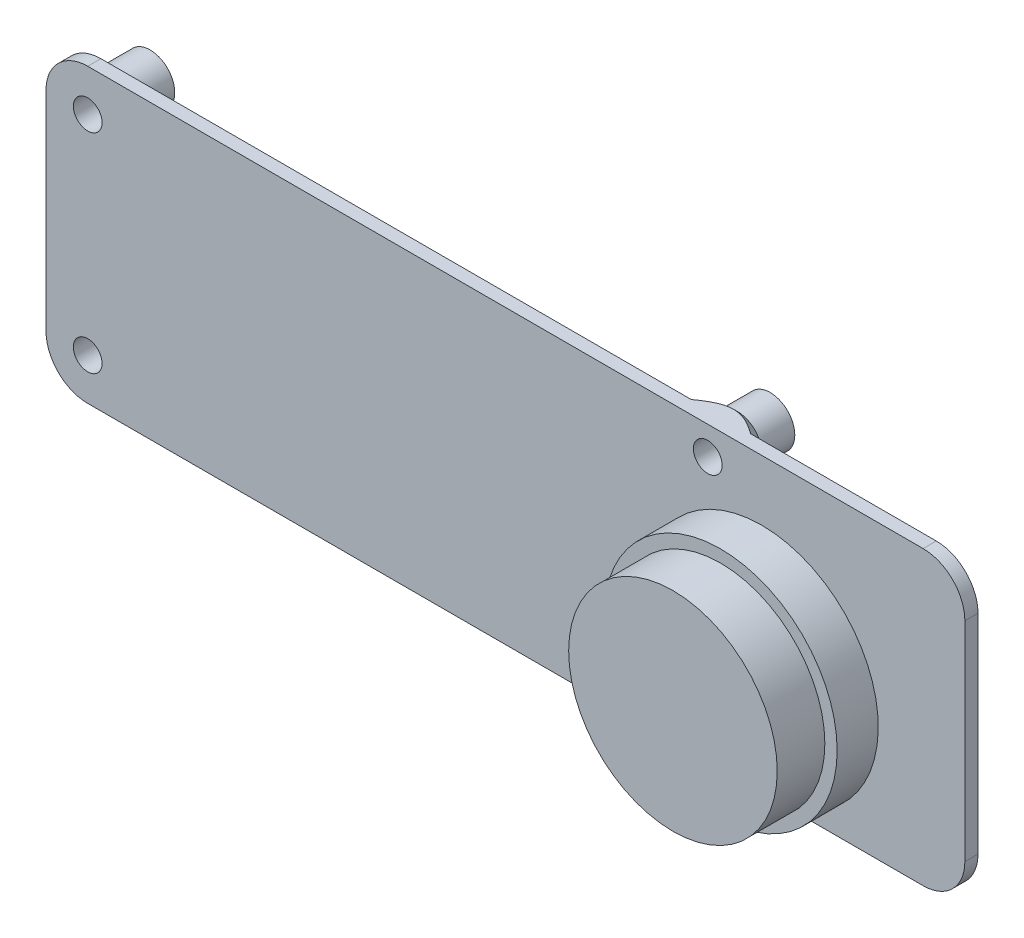
ISO-10303-21;
HEADER;
FILE_DESCRIPTION(('STEP AP214'),'2;1');
FILE_NAME('part.step','',(''),(''),'','','');
FILE_SCHEMA(('AUTOMOTIVE_DESIGN { 1 0 10303 214 1 1 1 1 }'));
ENDSEC;
DATA;
#1=APPLICATION_CONTEXT('core data for automotive mechanical design processes');
#2=APPLICATION_PROTOCOL_DEFINITION('international standard','automotive_design',2000,#1);
#3=PRODUCT_CONTEXT('',#1,'mechanical');
#4=PRODUCT('Part','Part','',(#3));
#5=PRODUCT_RELATED_PRODUCT_CATEGORY('part','',(#4));
#6=PRODUCT_DEFINITION_FORMATION('','',#4);
#7=PRODUCT_DEFINITION_CONTEXT('part definition',#1,'design');
#8=PRODUCT_DEFINITION('design','',#6,#7);
#9=PRODUCT_DEFINITION_SHAPE('','',#8);
#10=(LENGTH_UNIT() NAMED_UNIT(*) SI_UNIT(.MILLI.,.METRE.));
#11=(NAMED_UNIT(*) PLANE_ANGLE_UNIT() SI_UNIT($,.RADIAN.));
#12=(NAMED_UNIT(*) SI_UNIT($,.STERADIAN.) SOLID_ANGLE_UNIT());
#13=UNCERTAINTY_MEASURE_WITH_UNIT(LENGTH_MEASURE(1.E-05),#10,'distance_accuracy_value','');
#14=(GEOMETRIC_REPRESENTATION_CONTEXT(3) GLOBAL_UNCERTAINTY_ASSIGNED_CONTEXT((#13)) GLOBAL_UNIT_ASSIGNED_CONTEXT((#10,
#11,#12)) REPRESENTATION_CONTEXT('',''));
#15=CARTESIAN_POINT('',(0.,0.,0.));
#16=DIRECTION('',(0.,0.,1.));
#17=DIRECTION('',(1.,0.,0.));
#18=AXIS2_PLACEMENT_3D('',#15,#16,#17);
#19=CARTESIAN_POINT('',(0.,-25.4,1.6));
#20=DIRECTION('',(0.,0.,1.));
#21=DIRECTION('',(1.,0.,0.));
#22=AXIS2_PLACEMENT_3D('',#19,#20,#21);
#23=PLANE('',#22);
#24=CARTESIAN_POINT('',(64.33,-27.48,1.6));
#25=DIRECTION('',(0.,0.,1.));
#26=DIRECTION('',(1.,0.,0.));
#27=AXIS2_PLACEMENT_3D('',#24,#25,#26);
#28=CIRCLE('',#27,1.75);
#29=CARTESIAN_POINT('',(66.08,-27.48,1.6));
#30=VERTEX_POINT('',#29);
#31=EDGE_CURVE('E188',#30,#30,#28,.T.);
#32=ORIENTED_EDGE('',*,*,#31,.F.);
#33=EDGE_LOOP('',(#32));
#34=FACE_BOUND('',#33,.T.);
#35=CARTESIAN_POINT('',(0.,-25.4,1.6));
#36=DIRECTION('',(0.,0.,1.));
#37=DIRECTION('',(1.,0.,0.));
#38=AXIS2_PLACEMENT_3D('',#35,#36,#37);
#39=CIRCLE('',#38,1.75);
#40=CARTESIAN_POINT('',(1.75,-25.4,1.6));
#41=VERTEX_POINT('',#40);
#42=EDGE_CURVE('E194',#41,#41,#39,.T.);
#43=ORIENTED_EDGE('',*,*,#42,.F.);
#44=EDGE_LOOP('',(#43));
#45=FACE_BOUND('',#44,.T.);
#46=CARTESIAN_POINT('',(0.,0.,1.6));
#47=DIRECTION('',(0.,0.,1.));
#48=DIRECTION('',(1.,0.,0.));
#49=AXIS2_PLACEMENT_3D('',#46,#47,#48);
#50=CIRCLE('',#49,1.75);
#51=CARTESIAN_POINT('',(1.75,0.,1.6));
#52=VERTEX_POINT('',#51);
#53=EDGE_CURVE('E197',#52,#52,#50,.T.);
#54=ORIENTED_EDGE('',*,*,#53,.F.);
#55=EDGE_LOOP('',(#54));
#56=FACE_BOUND('',#55,.T.);
#57=CARTESIAN_POINT('',(75.51,1.63,1.6));
#58=DIRECTION('',(0.,0.,1.));
#59=DIRECTION('',(1.,0.,0.));
#60=AXIS2_PLACEMENT_3D('',#57,#58,#59);
#61=CIRCLE('',#60,1.75);
#62=CARTESIAN_POINT('',(77.26,1.63,1.6));
#63=VERTEX_POINT('',#62);
#64=EDGE_CURVE('E191',#63,#63,#61,.T.);
#65=ORIENTED_EDGE('',*,*,#64,.F.);
#66=EDGE_LOOP('',(#65));
#67=FACE_BOUND('',#66,.T.);
#68=DIRECTION('',(1.,0.,0.));
#69=VECTOR('',#68,1.);
#70=CARTESIAN_POINT('',(0.,-30.48,1.6));
#71=LINE('',#70,#69);
#72=CARTESIAN_POINT('',(0.,-30.48,1.6));
#73=VERTEX_POINT('',#72);
#74=CARTESIAN_POINT('',(79.6951315825924,-30.48,1.6));
#75=VERTEX_POINT('',#74);
#76=EDGE_CURVE('E140',#73,#75,#71,.T.);
#77=ORIENTED_EDGE('',*,*,#76,.T.);
#78=CARTESIAN_POINT('',(82.07,-16.48,1.6));
#79=DIRECTION('',(0.,0.,1.));
#80=DIRECTION('',(1.,0.,0.));
#81=AXIS2_PLACEMENT_3D('',#78,#79,#80);
#82=CIRCLE('',#81,14.2);
#83=CARTESIAN_POINT('',(84.4448684174076,-30.48,1.6));
#84=VERTEX_POINT('',#83);
#85=EDGE_CURVE('E144',#84,#75,#82,.T.);
#86=ORIENTED_EDGE('',*,*,#85,.F.);
#87=CARTESIAN_POINT('',(101.74,-30.48,1.6));
#88=VERTEX_POINT('',#87);
#89=EDGE_CURVE('E130',#84,#88,#71,.T.);
#90=ORIENTED_EDGE('',*,*,#89,.T.);
#91=CARTESIAN_POINT('',(101.74,-25.4,1.6));
#92=DIRECTION('',(0.,0.,1.));
#93=DIRECTION('',(1.,0.,0.));
#94=AXIS2_PLACEMENT_3D('',#91,#92,#93);
#95=CIRCLE('',#94,5.08);
#96=CARTESIAN_POINT('',(106.82,-25.4,1.6));
#97=VERTEX_POINT('',#96);
#98=EDGE_CURVE('E203',#88,#97,#95,.T.);
#99=ORIENTED_EDGE('',*,*,#98,.T.);
#100=DIRECTION('',(0.,1.,0.));
#101=VECTOR('',#100,1.);
#102=CARTESIAN_POINT('',(106.82,0.,1.6));
#103=LINE('',#102,#101);
#104=CARTESIAN_POINT('',(106.82,0.,1.6));
#105=VERTEX_POINT('',#104);
#106=EDGE_CURVE('E205',#97,#105,#103,.T.);
#107=ORIENTED_EDGE('',*,*,#106,.T.);
#108=CARTESIAN_POINT('',(101.74,0.,1.6));
#109=DIRECTION('',(0.,0.,1.));
#110=DIRECTION('',(-1.,0.,0.));
#111=AXIS2_PLACEMENT_3D('',#108,#109,#110);
#112=CIRCLE('',#111,5.08);
#113=CARTESIAN_POINT('',(101.74,5.08,1.6));
#114=VERTEX_POINT('',#113);
#115=EDGE_CURVE('E207',#105,#114,#112,.T.);
#116=ORIENTED_EDGE('',*,*,#115,.T.);
#117=DIRECTION('',(-1.,0.,0.));
#118=VECTOR('',#117,1.);
#119=CARTESIAN_POINT('',(0.,5.08,1.6));
#120=LINE('',#119,#118);
#121=CARTESIAN_POINT('',(0.,5.08,1.6));
#122=VERTEX_POINT('',#121);
#123=EDGE_CURVE('E209',#114,#122,#120,.T.);
#124=ORIENTED_EDGE('',*,*,#123,.T.);
#125=CARTESIAN_POINT('',(0.,0.,1.6));
#126=DIRECTION('',(0.,0.,1.));
#127=DIRECTION('',(1.,0.,0.));
#128=AXIS2_PLACEMENT_3D('',#125,#126,#127);
#129=CIRCLE('',#128,5.08);
#130=CARTESIAN_POINT('',(-5.08,0.,1.6));
#131=VERTEX_POINT('',#130);
#132=EDGE_CURVE('E211',#122,#131,#129,.T.);
#133=ORIENTED_EDGE('',*,*,#132,.T.);
#134=DIRECTION('',(0.,-1.,0.));
#135=VECTOR('',#134,1.);
#136=CARTESIAN_POINT('',(-5.08,0.,1.6));
#137=LINE('',#136,#135);
#138=CARTESIAN_POINT('',(-5.08,-25.4,1.6));
#139=VERTEX_POINT('',#138);
#140=EDGE_CURVE('E213',#131,#139,#137,.T.);
#141=ORIENTED_EDGE('',*,*,#140,.T.);
#142=CARTESIAN_POINT('',(0.,-25.4,1.6));
#143=DIRECTION('',(0.,0.,1.));
#144=DIRECTION('',(1.,0.,0.));
#145=AXIS2_PLACEMENT_3D('',#142,#143,#144);
#146=CIRCLE('',#145,5.08);
#147=EDGE_CURVE('E141',#139,#73,#146,.T.);
#148=ORIENTED_EDGE('',*,*,#147,.T.);
#149=EDGE_LOOP('',(#77,#86,#90,#99,#107,#116,#124,#133,#141,#148));
#150=FACE_BOUND('',#149,.T.);
#151=ADVANCED_FACE('F41',(#34,#45,#56,#67,#150),#23,.T.);
#152=CARTESIAN_POINT('',(0.,-25.4,0.));
#153=DIRECTION('',(0.,0.,1.));
#154=DIRECTION('',(1.,0.,0.));
#155=AXIS2_PLACEMENT_3D('',#152,#153,#154);
#156=PLANE('',#155);
#157=CARTESIAN_POINT('',(0.,-25.4,0.));
#158=DIRECTION('',(0.,0.,1.));
#159=DIRECTION('',(1.,0.,0.));
#160=AXIS2_PLACEMENT_3D('',#157,#158,#159);
#161=CIRCLE('',#160,4.99999999999999);
#162=CARTESIAN_POINT('',(4.99999999999999,-25.4,0.));
#163=VERTEX_POINT('',#162);
#164=EDGE_CURVE('E266',#163,#163,#161,.T.);
#165=ORIENTED_EDGE('',*,*,#164,.T.);
#166=EDGE_LOOP('',(#165));
#167=FACE_BOUND('',#166,.T.);
#168=CARTESIAN_POINT('',(0.,0.,0.));
#169=DIRECTION('',(0.,0.,1.));
#170=DIRECTION('',(1.,0.,0.));
#171=AXIS2_PLACEMENT_3D('',#168,#169,#170);
#172=CIRCLE('',#171,5.);
#173=CARTESIAN_POINT('',(5.,0.,0.));
#174=VERTEX_POINT('',#173);
#175=EDGE_CURVE('E263',#174,#174,#172,.T.);
#176=ORIENTED_EDGE('',*,*,#175,.T.);
#177=EDGE_LOOP('',(#176));
#178=FACE_BOUND('',#177,.T.);
#179=DIRECTION('',(-1.,0.,0.));
#180=VECTOR('',#179,1.);
#181=CARTESIAN_POINT('',(0.,5.08,0.));
#182=LINE('',#181,#180);
#183=CARTESIAN_POINT('',(71.8909531641605,5.08,0.));
#184=VERTEX_POINT('',#183);
#185=CARTESIAN_POINT('',(0.,5.08,0.));
#186=VERTEX_POINT('',#185);
#187=EDGE_CURVE('E227',#184,#186,#182,.T.);
#188=ORIENTED_EDGE('',*,*,#187,.F.);
#189=CARTESIAN_POINT('',(75.51,1.63,0.));
#190=DIRECTION('',(0.,0.,1.));
#191=DIRECTION('',(1.,0.,0.));
#192=AXIS2_PLACEMENT_3D('',#189,#190,#191);
#193=CIRCLE('',#192,4.99999999999999);
#194=CARTESIAN_POINT('',(79.1290468358395,5.08,0.));
#195=VERTEX_POINT('',#194);
#196=EDGE_CURVE('E260',#184,#195,#193,.T.);
#197=ORIENTED_EDGE('',*,*,#196,.T.);
#198=CARTESIAN_POINT('',(101.74,5.08,0.));
#199=VERTEX_POINT('',#198);
#200=EDGE_CURVE('E228',#199,#195,#182,.T.);
#201=ORIENTED_EDGE('',*,*,#200,.F.);
#202=CARTESIAN_POINT('',(101.74,0.,0.));
#203=DIRECTION('',(0.,0.,1.));
#204=DIRECTION('',(-1.,0.,0.));
#205=AXIS2_PLACEMENT_3D('',#202,#203,#204);
#206=CIRCLE('',#205,5.08);
#207=CARTESIAN_POINT('',(106.82,0.,0.));
#208=VERTEX_POINT('',#207);
#209=EDGE_CURVE('E225',#208,#199,#206,.T.);
#210=ORIENTED_EDGE('',*,*,#209,.F.);
#211=DIRECTION('',(0.,1.,0.));
#212=VECTOR('',#211,1.);
#213=CARTESIAN_POINT('',(106.82,0.,0.));
#214=LINE('',#213,#212);
#215=CARTESIAN_POINT('',(106.82,-25.4,0.));
#216=VERTEX_POINT('',#215);
#217=EDGE_CURVE('E223',#216,#208,#214,.T.);
#218=ORIENTED_EDGE('',*,*,#217,.F.);
#219=CARTESIAN_POINT('',(101.74,-25.4,0.));
#220=DIRECTION('',(0.,0.,1.));
#221=DIRECTION('',(1.,0.,0.));
#222=AXIS2_PLACEMENT_3D('',#219,#220,#221);
#223=CIRCLE('',#222,5.08);
#224=CARTESIAN_POINT('',(101.74,-30.48,0.));
#225=VERTEX_POINT('',#224);
#226=EDGE_CURVE('E221',#225,#216,#223,.T.);
#227=ORIENTED_EDGE('',*,*,#226,.F.);
#228=DIRECTION('',(1.,0.,0.));
#229=VECTOR('',#228,1.);
#230=CARTESIAN_POINT('',(0.,-30.48,0.));
#231=LINE('',#230,#229);
#232=CARTESIAN_POINT('',(68.33,-30.48,0.));
#233=VERTEX_POINT('',#232);
#234=EDGE_CURVE('E218',#233,#225,#231,.T.);
#235=ORIENTED_EDGE('',*,*,#234,.F.);
#236=CARTESIAN_POINT('',(64.33,-27.48,0.));
#237=DIRECTION('',(0.,0.,1.));
#238=DIRECTION('',(1.,0.,0.));
#239=AXIS2_PLACEMENT_3D('',#236,#237,#238);
#240=CIRCLE('',#239,4.99999999999999);
#241=CARTESIAN_POINT('',(60.33,-30.48,0.));
#242=VERTEX_POINT('',#241);
#243=EDGE_CURVE('E257',#233,#242,#240,.T.);
#244=ORIENTED_EDGE('',*,*,#243,.T.);
#245=CARTESIAN_POINT('',(0.,-30.48,0.));
#246=VERTEX_POINT('',#245);
#247=EDGE_CURVE('E219',#246,#242,#231,.T.);
#248=ORIENTED_EDGE('',*,*,#247,.F.);
#249=CARTESIAN_POINT('',(0.,-25.4,0.));
#250=DIRECTION('',(0.,0.,1.));
#251=DIRECTION('',(1.,0.,0.));
#252=AXIS2_PLACEMENT_3D('',#249,#250,#251);
#253=CIRCLE('',#252,5.08);
#254=CARTESIAN_POINT('',(-5.08,-25.4,0.));
#255=VERTEX_POINT('',#254);
#256=EDGE_CURVE('E200',#255,#246,#253,.T.);
#257=ORIENTED_EDGE('',*,*,#256,.F.);
#258=DIRECTION('',(0.,-1.,0.));
#259=VECTOR('',#258,1.);
#260=CARTESIAN_POINT('',(-5.08,0.,0.));
#261=LINE('',#260,#259);
#262=CARTESIAN_POINT('',(-5.08,0.,0.));
#263=VERTEX_POINT('',#262);
#264=EDGE_CURVE('E201',#263,#255,#261,.T.);
#265=ORIENTED_EDGE('',*,*,#264,.F.);
#266=CARTESIAN_POINT('',(0.,0.,0.));
#267=DIRECTION('',(0.,0.,1.));
#268=DIRECTION('',(1.,0.,0.));
#269=AXIS2_PLACEMENT_3D('',#266,#267,#268);
#270=CIRCLE('',#269,5.08);
#271=EDGE_CURVE('E230',#186,#263,#270,.T.);
#272=ORIENTED_EDGE('',*,*,#271,.F.);
#273=EDGE_LOOP('',(#188,#197,#201,#210,#218,#227,#235,#244,#248,#257,#265,#272));
#274=FACE_BOUND('',#273,.T.);
#275=ADVANCED_FACE('F316',(#167,#178,#274),#156,.F.);
#276=CARTESIAN_POINT('',(0.,-25.4,1.6));
#277=DIRECTION('',(0.,0.,-1.));
#278=DIRECTION('',(-1.,0.,0.));
#279=AXIS2_PLACEMENT_3D('',#276,#277,#278);
#280=CYLINDRICAL_SURFACE('',#279,5.08);
#281=ORIENTED_EDGE('',*,*,#256,.T.);
#282=DIRECTION('',(0.,0.,-1.));
#283=VECTOR('',#282,1.);
#284=CARTESIAN_POINT('',(0.,-30.48,1.6));
#285=LINE('',#284,#283);
#286=EDGE_CURVE('E251',#73,#246,#285,.T.);
#287=ORIENTED_EDGE('',*,*,#286,.F.);
#288=ORIENTED_EDGE('',*,*,#147,.F.);
#289=DIRECTION('',(0.,0.,-1.));
#290=VECTOR('',#289,1.);
#291=CARTESIAN_POINT('',(-5.08,-25.4,1.6));
#292=LINE('',#291,#290);
#293=EDGE_CURVE('E215',#139,#255,#292,.T.);
#294=ORIENTED_EDGE('',*,*,#293,.T.);
#295=EDGE_LOOP('',(#281,#287,#288,#294));
#296=FACE_BOUND('',#295,.T.);
#297=ADVANCED_FACE('F314',(#296),#280,.T.);
#298=CARTESIAN_POINT('',(0.,-30.48,1.6));
#299=DIRECTION('',(0.,1.,0.));
#300=DIRECTION('',(0.,0.,1.));
#301=AXIS2_PLACEMENT_3D('',#298,#299,#300);
#302=PLANE('',#301);
#303=ORIENTED_EDGE('',*,*,#247,.T.);
#304=CARTESIAN_POINT('',(60.33,-30.48,0.));
#305=CARTESIAN_POINT('',(60.4042045666358,-30.48,-0.0593600465069753));
#306=CARTESIAN_POINT('',(60.4786951441885,-30.48,-0.118362128846301));
#307=CARTESIAN_POINT('',(60.6283359131911,-30.48,-0.235532965714645));
#308=CARTESIAN_POINT('',(60.7034861450909,-30.48,-0.293701668556894));
#309=CARTESIAN_POINT('',(60.9303044347763,-30.48,-0.466969643006251));
#310=CARTESIAN_POINT('',(61.0830846810868,-30.48,-0.580625166081469));
#311=CARTESIAN_POINT('',(61.3978855060882,-30.48,-0.806570760726502));
#312=CARTESIAN_POINT('',(61.5600421027586,-30.48,-0.91867231134009));
#313=CARTESIAN_POINT('',(61.8895973852149,-30.48,-1.13476511479384));
#314=CARTESIAN_POINT('',(62.05699221458,-30.48,-1.23876214611068));
#315=CARTESIAN_POINT('',(62.3330604091188,-30.48,-1.3971694347975));
#316=CARTESIAN_POINT('',(62.4395984344024,-30.48,-1.45528558907362));
#317=CARTESIAN_POINT('',(62.6557285649442,-30.48,-1.56568198582262));
#318=CARTESIAN_POINT('',(62.7653215190622,-30.48,-1.61796058562693));
#319=CARTESIAN_POINT('',(62.9864202954857,-30.48,-1.7143588600513));
#320=CARTESIAN_POINT('',(63.0978842075391,-30.48,-1.75857363454419));
#321=CARTESIAN_POINT('',(63.3240547037457,-30.48,-1.83760583606441));
#322=CARTESIAN_POINT('',(63.4387579611664,-30.48,-1.87243254259444));
#323=CARTESIAN_POINT('',(63.6178403889869,-30.48,-1.917233062674));
#324=CARTESIAN_POINT('',(63.6812103898271,-30.48,-1.93128449976482));
#325=CARTESIAN_POINT('',(63.8086539853925,-30.48,-1.95567882607544));
#326=CARTESIAN_POINT('',(63.8727274161421,-30.48,-1.96602256143755));
#327=CARTESIAN_POINT('',(64.0021656255051,-30.48,-1.98282939929949));
#328=CARTESIAN_POINT('',(64.0675366807644,-30.48,-1.98924456364397));
#329=CARTESIAN_POINT('',(64.1986018968021,-30.48,-1.99784210181405));
#330=CARTESIAN_POINT('',(64.264296254929,-30.48,-2.00002145058361));
#331=CARTESIAN_POINT('',(64.33,-30.48,-2.00000000000002));
#332=B_SPLINE_CURVE_WITH_KNOTS('',3,(#304,#305,#306,#307,#308,#309,#310,#311,#312,#313,#314,
#315,#316,#317,#318,#319,#320,#321,#322,#323,#324,#325,#326,#327,#328,#329,#330,#331),
.UNSPECIFIED.,.F.,.F.,(4,2,2,2,2,2,2,2,2,2,2,2,2,4),(0.,0.285075346497055,0.570168297685432,
1.14133762065735,1.73258973397109,2.32341635583755,2.6873570090875,3.05139981731677,
3.41082388918195,3.76989137977573,3.9645257221408,4.1591156182755,4.3560349873879,
4.55309493711647),.UNSPECIFIED.);
#333=CARTESIAN_POINT('',(64.33,-30.48,-2.00000000000002));
#334=VERTEX_POINT('',#333);
#335=EDGE_CURVE('E11',#242,#334,#332,.T.);
#336=ORIENTED_EDGE('',*,*,#335,.T.);
#337=CARTESIAN_POINT('',(64.33,-30.48,-2.00000000000002));
#338=CARTESIAN_POINT('',(64.3761354149615,-30.48,-2.00000371177859));
#339=CARTESIAN_POINT('',(64.4222640277094,-30.48,-1.99893522458333));
#340=CARTESIAN_POINT('',(64.5144166806191,-30.48,-1.99468881207754));
#341=CARTESIAN_POINT('',(64.5604407367487,-30.48,-1.99151123412403));
#342=CARTESIAN_POINT('',(64.6980364575231,-30.48,-1.97888565339324));
#343=CARTESIAN_POINT('',(64.7893392979656,-30.48,-1.96634448765126));
#344=CARTESIAN_POINT('',(64.9689770689493,-30.48,-1.93395904526895));
#345=CARTESIAN_POINT('',(65.0573360217277,-30.48,-1.91424472614783));
#346=CARTESIAN_POINT('',(65.2323840019678,-30.48,-1.86836133852704));
#347=CARTESIAN_POINT('',(65.3190722051613,-30.48,-1.84218916768549));
#348=CARTESIAN_POINT('',(65.5929254358614,-30.48,-1.74983489322469));
#349=CARTESIAN_POINT('',(65.7765592477129,-30.48,-1.67317492159161));
#350=CARTESIAN_POINT('',(66.1354420774485,-30.48,-1.50219964965461));
#351=CARTESIAN_POINT('',(66.3106744884321,-30.48,-1.40785105635736));
#352=CARTESIAN_POINT('',(66.6568100950514,-30.48,-1.20605249188957));
#353=CARTESIAN_POINT('',(66.8276110962395,-30.48,-1.09842956922804));
#354=CARTESIAN_POINT('',(67.1636564132451,-30.48,-0.875213025888325));
#355=CARTESIAN_POINT('',(67.3289049221925,-30.48,-0.759625630668685));
#356=CARTESIAN_POINT('',(67.6355351707639,-30.48,-0.537169784425063));
#357=CARTESIAN_POINT('',(67.777383854367,-30.48,-0.430940484488483));
#358=CARTESIAN_POINT('',(67.9872151969223,-30.48,-0.269962000951696));
#359=CARTESIAN_POINT('',(68.05615045823,-30.48,-0.216446991968315));
#360=CARTESIAN_POINT('',(68.1934710548399,-30.48,-0.108722016700328));
#361=CARTESIAN_POINT('',(68.2618564147369,-30.48,-0.0545120817814854));
#362=CARTESIAN_POINT('',(68.33,-30.48,0.));
#363=B_SPLINE_CURVE_WITH_KNOTS('',3,(#337,#338,#339,#340,#341,#342,#343,#344,#345,#346,#347,
#348,#349,#350,#351,#352,#353,#354,#355,#356,#357,#358,#359,#360,#361,#362),.UNSPECIFIED.,.F.,
.F.,(4,2,2,2,2,2,2,2,2,2,2,2,4),(0.,0.138380878645855,0.276738972285148,0.552834640213549,
0.824158840019247,1.09561363818839,1.69096802813075,2.28745443526049,2.89275248259271,
3.49758264932597,4.02917096400334,4.29097525092169,4.55276776251418),.UNSPECIFIED.);
#364=EDGE_CURVE('E56',#334,#233,#363,.T.);
#365=ORIENTED_EDGE('',*,*,#364,.T.);
#366=ORIENTED_EDGE('',*,*,#234,.T.);
#367=DIRECTION('',(0.,0.,-1.));
#368=VECTOR('',#367,1.);
#369=CARTESIAN_POINT('',(101.74,-30.48,1.6));
#370=LINE('',#369,#368);
#371=EDGE_CURVE('E137',#88,#225,#370,.T.);
#372=ORIENTED_EDGE('',*,*,#371,.F.);
#373=ORIENTED_EDGE('',*,*,#89,.F.);
#374=DIRECTION('',(1.,0.,0.));
#375=VECTOR('',#374,1.);
#376=CARTESIAN_POINT('',(0.,-30.48,1.6));
#377=LINE('',#376,#375);
#378=EDGE_CURVE('E134',#75,#84,#377,.T.);
#379=ORIENTED_EDGE('',*,*,#378,.F.);
#380=ORIENTED_EDGE('',*,*,#76,.F.);
#381=ORIENTED_EDGE('',*,*,#286,.T.);
#382=EDGE_LOOP('',(#303,#336,#365,#366,#372,#373,#379,#380,#381));
#383=FACE_BOUND('',#382,.T.);
#384=ADVANCED_FACE('F132',(#383),#302,.F.);
#385=CARTESIAN_POINT('',(101.74,-25.4,1.6));
#386=DIRECTION('',(0.,0.,-1.));
#387=DIRECTION('',(-1.,0.,0.));
#388=AXIS2_PLACEMENT_3D('',#385,#386,#387);
#389=CYLINDRICAL_SURFACE('',#388,5.08);
#390=ORIENTED_EDGE('',*,*,#226,.T.);
#391=DIRECTION('',(0.,0.,-1.));
#392=VECTOR('',#391,1.);
#393=CARTESIAN_POINT('',(106.82,-25.4,1.6));
#394=LINE('',#393,#392);
#395=EDGE_CURVE('E247',#97,#216,#394,.T.);
#396=ORIENTED_EDGE('',*,*,#395,.F.);
#397=ORIENTED_EDGE('',*,*,#98,.F.);
#398=ORIENTED_EDGE('',*,*,#371,.T.);
#399=EDGE_LOOP('',(#390,#396,#397,#398));
#400=FACE_BOUND('',#399,.T.);
#401=ADVANCED_FACE('F321',(#400),#389,.T.);
#402=CARTESIAN_POINT('',(106.82,0.,1.6));
#403=DIRECTION('',(-1.,0.,0.));
#404=DIRECTION('',(0.,0.,1.));
#405=AXIS2_PLACEMENT_3D('',#402,#403,#404);
#406=PLANE('',#405);
#407=ORIENTED_EDGE('',*,*,#217,.T.);
#408=DIRECTION('',(0.,0.,-1.));
#409=VECTOR('',#408,1.);
#410=CARTESIAN_POINT('',(106.82,0.,1.6));
#411=LINE('',#410,#409);
#412=EDGE_CURVE('E244',#105,#208,#411,.T.);
#413=ORIENTED_EDGE('',*,*,#412,.F.);
#414=ORIENTED_EDGE('',*,*,#106,.F.);
#415=ORIENTED_EDGE('',*,*,#395,.T.);
#416=EDGE_LOOP('',(#407,#413,#414,#415));
#417=FACE_BOUND('',#416,.T.);
#418=ADVANCED_FACE('F325',(#417),#406,.F.);
#419=CARTESIAN_POINT('',(101.74,0.,1.6));
#420=DIRECTION('',(0.,0.,-1.));
#421=DIRECTION('',(-1.,0.,0.));
#422=AXIS2_PLACEMENT_3D('',#419,#420,#421);
#423=CYLINDRICAL_SURFACE('',#422,5.08);
#424=ORIENTED_EDGE('',*,*,#209,.T.);
#425=DIRECTION('',(0.,0.,-1.));
#426=VECTOR('',#425,1.);
#427=CARTESIAN_POINT('',(101.74,5.08,1.6));
#428=LINE('',#427,#426);
#429=EDGE_CURVE('E241',#114,#199,#428,.T.);
#430=ORIENTED_EDGE('',*,*,#429,.F.);
#431=ORIENTED_EDGE('',*,*,#115,.F.);
#432=ORIENTED_EDGE('',*,*,#412,.T.);
#433=EDGE_LOOP('',(#424,#430,#431,#432));
#434=FACE_BOUND('',#433,.T.);
#435=ADVANCED_FACE('F328',(#434),#423,.T.);
#436=CARTESIAN_POINT('',(0.,5.08,1.6));
#437=DIRECTION('',(0.,-1.,0.));
#438=DIRECTION('',(0.,0.,-1.));
#439=AXIS2_PLACEMENT_3D('',#436,#437,#438);
#440=PLANE('',#439);
#441=ORIENTED_EDGE('',*,*,#200,.T.);
#442=CARTESIAN_POINT('',(79.1290468358395,5.08,0.));
#443=CARTESIAN_POINT('',(79.0315945067503,5.08,-0.0705157232223393));
#444=CARTESIAN_POINT('',(78.9335090841336,5.08,-0.140174208744895));
#445=CARTESIAN_POINT('',(78.7358115203641,5.08,-0.277369715557429));
#446=CARTESIAN_POINT('',(78.6361988035316,5.08,-0.344905906113015));
#447=CARTESIAN_POINT('',(78.4341140156061,5.08,-0.478150989252596));
#448=CARTESIAN_POINT('',(78.3316222831519,5.08,-0.543830213949148));
#449=CARTESIAN_POINT('',(78.1246329458006,5.08,-0.671929869406897));
#450=CARTESIAN_POINT('',(78.0201355451997,5.08,-0.734350629689198));
#451=CARTESIAN_POINT('',(77.8044893759145,5.08,-0.857652689868404));
#452=CARTESIAN_POINT('',(77.6932434437955,5.08,-0.918366351637153));
#453=CARTESIAN_POINT('',(77.46794240831,5.08,-1.03430985365339));
#454=CARTESIAN_POINT('',(77.3538867645616,5.08,-1.089538628572));
#455=CARTESIAN_POINT('',(77.0080149202814,5.08,-1.24444226102224));
#456=CARTESIAN_POINT('',(76.7713002242767,5.08,-1.33404997933809));
#457=CARTESIAN_POINT('',(76.4146899482032,5.08,-1.43502698879264));
#458=CARTESIAN_POINT('',(76.2993756982636,5.08,-1.46269155059348));
#459=CARTESIAN_POINT('',(76.06661487289,5.08,-1.50725221824941));
#460=CARTESIAN_POINT('',(75.9491680268961,5.08,-1.52414694779213));
#461=CARTESIAN_POINT('',(75.7150346342493,5.08,-1.54584632026062));
#462=CARTESIAN_POINT('',(75.5983658048573,5.08,-1.55083936758045));
#463=CARTESIAN_POINT('',(75.3651282708847,5.08,-1.54892926532315));
#464=CARTESIAN_POINT('',(75.2485595643313,5.08,-1.54202635580252));
#465=CARTESIAN_POINT('',(75.0172036367805,5.08,-1.51687337115469));
#466=CARTESIAN_POINT('',(74.9024107972705,5.08,-1.49867391616871));
#467=CARTESIAN_POINT('',(74.6749210471169,5.08,-1.45212106466187));
#468=CARTESIAN_POINT('',(74.562224473434,5.08,-1.42376605028919));
#469=CARTESIAN_POINT('',(74.3377112434929,5.08,-1.35787752204195));
#470=CARTESIAN_POINT('',(74.2259343503218,5.08,-1.32021036995785));
#471=CARTESIAN_POINT('',(74.0051892646719,5.08,-1.23748948224965));
#472=CARTESIAN_POINT('',(73.8962210094665,5.08,-1.19243591175528));
#473=CARTESIAN_POINT('',(73.6164291067043,5.08,-1.06753022851015));
#474=CARTESIAN_POINT('',(73.4476970566075,5.08,-0.983011640270327));
#475=CARTESIAN_POINT('',(73.1160423313302,5.08,-0.803081941345173));
#476=CARTESIAN_POINT('',(72.9531261398184,5.08,-0.707659143228296));
#477=CARTESIAN_POINT('',(72.6382185456412,5.08,-0.51280360496077));
#478=CARTESIAN_POINT('',(72.486047075208,5.08,-0.413659648976501));
#479=CARTESIAN_POINT('',(72.2607245292928,5.08,-0.261090477235211));
#480=CARTESIAN_POINT('',(72.1862046627797,5.08,-0.209663825652991));
#481=CARTESIAN_POINT('',(72.037987612292,5.08,-0.10565741709452));
#482=CARTESIAN_POINT('',(71.9642903244801,5.08,-0.0530778082026191));
#483=CARTESIAN_POINT('',(71.8909531641605,5.08,0.));
#484=B_SPLINE_CURVE_WITH_KNOTS('',3,(#442,#443,#444,#445,#446,#447,#448,#449,#450,#451,#452,
#453,#454,#455,#456,#457,#458,#459,#460,#461,#462,#463,#464,#465,#466,#467,#468,#469,#470,#471,
#472,#473,#474,#475,#476,#477,#478,#479,#480,#481,#482,#483),.UNSPECIFIED.,.F.,.F.,(4,2,2,2,2,2,
2,2,2,2,2,2,2,2,2,2,2,2,2,2,4),(0.,0.360877232941856,0.721894008426871,1.08703277243548,
1.45213453897024,1.83218303421761,2.21230520245886,2.96839101639909,3.32373836173002,
3.67913110897113,4.02885947769452,4.37858078909719,4.72674619136643,5.07496708351434,
5.42850925259039,5.78204351900574,6.34757648265183,6.91372138835516,7.45842244159258,
7.73004126825074,8.00162541054475),.UNSPECIFIED.);
#485=EDGE_CURVE('E69',#195,#184,#484,.T.);
#486=ORIENTED_EDGE('',*,*,#485,.T.);
#487=ORIENTED_EDGE('',*,*,#187,.T.);
#488=DIRECTION('',(0.,0.,-1.));
#489=VECTOR('',#488,1.);
#490=CARTESIAN_POINT('',(0.,5.08,1.6));
#491=LINE('',#490,#489);
#492=EDGE_CURVE('E238',#122,#186,#491,.T.);
#493=ORIENTED_EDGE('',*,*,#492,.F.);
#494=ORIENTED_EDGE('',*,*,#123,.F.);
#495=ORIENTED_EDGE('',*,*,#429,.T.);
#496=EDGE_LOOP('',(#441,#486,#487,#493,#494,#495));
#497=FACE_BOUND('',#496,.T.);
#498=ADVANCED_FACE('F287',(#497),#440,.F.);
#499=CARTESIAN_POINT('',(0.,0.,1.6));
#500=DIRECTION('',(0.,0.,-1.));
#501=DIRECTION('',(-1.,0.,0.));
#502=AXIS2_PLACEMENT_3D('',#499,#500,#501);
#503=CYLINDRICAL_SURFACE('',#502,5.08);
#504=ORIENTED_EDGE('',*,*,#271,.T.);
#505=DIRECTION('',(0.,0.,-1.));
#506=VECTOR('',#505,1.);
#507=CARTESIAN_POINT('',(-5.08,0.,1.6));
#508=LINE('',#507,#506);
#509=EDGE_CURVE('E235',#131,#263,#508,.T.);
#510=ORIENTED_EDGE('',*,*,#509,.F.);
#511=ORIENTED_EDGE('',*,*,#132,.F.);
#512=ORIENTED_EDGE('',*,*,#492,.T.);
#513=EDGE_LOOP('',(#504,#510,#511,#512));
#514=FACE_BOUND('',#513,.T.);
#515=ADVANCED_FACE('F336',(#514),#503,.T.);
#516=CARTESIAN_POINT('',(-5.08,0.,1.6));
#517=DIRECTION('',(1.,0.,0.));
#518=DIRECTION('',(0.,1.,0.));
#519=AXIS2_PLACEMENT_3D('',#516,#517,#518);
#520=PLANE('',#519);
#521=ORIENTED_EDGE('',*,*,#264,.T.);
#522=ORIENTED_EDGE('',*,*,#293,.F.);
#523=ORIENTED_EDGE('',*,*,#140,.F.);
#524=ORIENTED_EDGE('',*,*,#509,.T.);
#525=EDGE_LOOP('',(#521,#522,#523,#524));
#526=FACE_BOUND('',#525,.T.);
#527=ADVANCED_FACE('F353',(#526),#520,.F.);
#528=CARTESIAN_POINT('',(0.,0.,1.6));
#529=DIRECTION('',(0.,0.,-1.));
#530=DIRECTION('',(-1.,0.,0.));
#531=AXIS2_PLACEMENT_3D('',#528,#529,#530);
#532=CYLINDRICAL_SURFACE('',#531,1.75);
#533=ORIENTED_EDGE('',*,*,#53,.T.);
#534=EDGE_LOOP('',(#533));
#535=FACE_BOUND('',#534,.T.);
#536=CARTESIAN_POINT('',(0.,0.,-6.));
#537=DIRECTION('',(0.,0.,-1.));
#538=DIRECTION('',(-1.,0.,0.));
#539=AXIS2_PLACEMENT_3D('',#536,#537,#538);
#540=CIRCLE('',#539,1.75);
#541=CARTESIAN_POINT('',(-1.75,0.,-6.));
#542=VERTEX_POINT('',#541);
#543=EDGE_CURVE('E164',#542,#542,#540,.T.);
#544=ORIENTED_EDGE('',*,*,#543,.T.);
#545=EDGE_LOOP('',(#544));
#546=FACE_BOUND('',#545,.T.);
#547=ADVANCED_FACE('F350',(#535,#546),#532,.F.);
#548=CARTESIAN_POINT('',(0.,-25.4,1.6));
#549=DIRECTION('',(0.,0.,-1.));
#550=DIRECTION('',(-1.,0.,0.));
#551=AXIS2_PLACEMENT_3D('',#548,#549,#550);
#552=CYLINDRICAL_SURFACE('',#551,1.75);
#553=ORIENTED_EDGE('',*,*,#42,.T.);
#554=EDGE_LOOP('',(#553));
#555=FACE_BOUND('',#554,.T.);
#556=CARTESIAN_POINT('',(0.,-25.4,-6.));
#557=DIRECTION('',(0.,0.,-1.));
#558=DIRECTION('',(-1.,0.,0.));
#559=AXIS2_PLACEMENT_3D('',#556,#557,#558);
#560=CIRCLE('',#559,1.75);
#561=CARTESIAN_POINT('',(-1.75,-25.4,-6.));
#562=VERTEX_POINT('',#561);
#563=EDGE_CURVE('E170',#562,#562,#560,.T.);
#564=ORIENTED_EDGE('',*,*,#563,.T.);
#565=EDGE_LOOP('',(#564));
#566=FACE_BOUND('',#565,.T.);
#567=ADVANCED_FACE('F394',(#555,#566),#552,.F.);
#568=CARTESIAN_POINT('',(75.51,1.63,1.6));
#569=DIRECTION('',(0.,0.,-1.));
#570=DIRECTION('',(-1.,0.,0.));
#571=AXIS2_PLACEMENT_3D('',#568,#569,#570);
#572=CYLINDRICAL_SURFACE('',#571,1.75);
#573=ORIENTED_EDGE('',*,*,#64,.T.);
#574=EDGE_LOOP('',(#573));
#575=FACE_BOUND('',#574,.T.);
#576=CARTESIAN_POINT('',(75.51,1.63,-6.));
#577=DIRECTION('',(0.,0.,-1.));
#578=DIRECTION('',(-1.,0.,0.));
#579=AXIS2_PLACEMENT_3D('',#576,#577,#578);
#580=CIRCLE('',#579,1.75);
#581=CARTESIAN_POINT('',(73.76,1.63,-6.));
#582=VERTEX_POINT('',#581);
#583=EDGE_CURVE('E179',#582,#582,#580,.T.);
#584=ORIENTED_EDGE('',*,*,#583,.T.);
#585=EDGE_LOOP('',(#584));
#586=FACE_BOUND('',#585,.T.);
#587=ADVANCED_FACE('F392',(#575,#586),#572,.F.);
#588=CARTESIAN_POINT('',(64.33,-27.48,1.6));
#589=DIRECTION('',(0.,0.,-1.));
#590=DIRECTION('',(-1.,0.,0.));
#591=AXIS2_PLACEMENT_3D('',#588,#589,#590);
#592=CYLINDRICAL_SURFACE('',#591,1.75);
#593=ORIENTED_EDGE('',*,*,#31,.T.);
#594=EDGE_LOOP('',(#593));
#595=FACE_BOUND('',#594,.T.);
#596=CARTESIAN_POINT('',(64.33,-27.48,-6.));
#597=DIRECTION('',(0.,0.,-1.));
#598=DIRECTION('',(-1.,0.,0.));
#599=AXIS2_PLACEMENT_3D('',#596,#597,#598);
#600=CIRCLE('',#599,1.75);
#601=CARTESIAN_POINT('',(62.58,-27.48,-6.));
#602=VERTEX_POINT('',#601);
#603=EDGE_CURVE('E176',#602,#602,#600,.T.);
#604=ORIENTED_EDGE('',*,*,#603,.T.);
#605=EDGE_LOOP('',(#604));
#606=FACE_BOUND('',#605,.T.);
#607=ADVANCED_FACE('F388',(#595,#606),#592,.F.);
#608=CARTESIAN_POINT('',(75.51,1.63,-6.));
#609=DIRECTION('',(0.,0.,-1.));
#610=DIRECTION('',(-1.,0.,0.));
#611=AXIS2_PLACEMENT_3D('',#608,#609,#610);
#612=PLANE('',#611);
#613=CARTESIAN_POINT('',(75.51,1.63,-6.));
#614=DIRECTION('',(0.,0.,-1.));
#615=DIRECTION('',(-1.,0.,0.));
#616=AXIS2_PLACEMENT_3D('',#613,#614,#615);
#617=CIRCLE('',#616,3.00000000000001);
#618=CARTESIAN_POINT('',(72.51,1.63,-6.));
#619=VERTEX_POINT('',#618);
#620=EDGE_CURVE('E182',#619,#619,#617,.T.);
#621=ORIENTED_EDGE('',*,*,#620,.T.);
#622=EDGE_LOOP('',(#621));
#623=FACE_BOUND('',#622,.T.);
#624=ORIENTED_EDGE('',*,*,#583,.F.);
#625=EDGE_LOOP('',(#624));
#626=FACE_BOUND('',#625,.T.);
#627=ADVANCED_FACE('F382',(#623,#626),#612,.T.);
#628=CARTESIAN_POINT('',(75.51,1.63,-6.));
#629=DIRECTION('',(0.,0.,1.));
#630=DIRECTION('',(1.,0.,0.));
#631=AXIS2_PLACEMENT_3D('',#628,#629,#630);
#632=CYLINDRICAL_SURFACE('',#631,3.00000000000001);
#633=CARTESIAN_POINT('',(75.51,1.63,-2.00000000000001));
#634=DIRECTION('',(0.,0.,1.));
#635=DIRECTION('',(1.,0.,0.));
#636=AXIS2_PLACEMENT_3D('',#633,#634,#635);
#637=CIRCLE('',#636,3.00000000000001);
#638=CARTESIAN_POINT('',(78.51,1.63,-2.00000000000001));
#639=VERTEX_POINT('',#638);
#640=EDGE_CURVE('E272',#639,#639,#637,.F.);
#641=ORIENTED_EDGE('',*,*,#640,.T.);
#642=EDGE_LOOP('',(#641));
#643=FACE_BOUND('',#642,.T.);
#644=ORIENTED_EDGE('',*,*,#620,.F.);
#645=EDGE_LOOP('',(#644));
#646=FACE_BOUND('',#645,.T.);
#647=ADVANCED_FACE('F378',(#643,#646),#632,.T.);
#648=CARTESIAN_POINT('',(64.33,-27.48,-6.));
#649=DIRECTION('',(0.,0.,-1.));
#650=DIRECTION('',(-1.,0.,0.));
#651=AXIS2_PLACEMENT_3D('',#648,#649,#650);
#652=PLANE('',#651);
#653=CARTESIAN_POINT('',(64.33,-27.48,-6.));
#654=DIRECTION('',(0.,0.,-1.));
#655=DIRECTION('',(-1.,0.,0.));
#656=AXIS2_PLACEMENT_3D('',#653,#654,#655);
#657=CIRCLE('',#656,3.);
#658=CARTESIAN_POINT('',(61.33,-27.48,-6.));
#659=VERTEX_POINT('',#658);
#660=EDGE_CURVE('E173',#659,#659,#657,.T.);
#661=ORIENTED_EDGE('',*,*,#660,.T.);
#662=EDGE_LOOP('',(#661));
#663=FACE_BOUND('',#662,.T.);
#664=ORIENTED_EDGE('',*,*,#603,.F.);
#665=EDGE_LOOP('',(#664));
#666=FACE_BOUND('',#665,.T.);
#667=ADVANCED_FACE('F381',(#663,#666),#652,.T.);
#668=CARTESIAN_POINT('',(64.33,-27.48,-6.));
#669=DIRECTION('',(0.,0.,1.));
#670=DIRECTION('',(1.,0.,0.));
#671=AXIS2_PLACEMENT_3D('',#668,#669,#670);
#672=CYLINDRICAL_SURFACE('',#671,3.);
#673=CARTESIAN_POINT('',(64.33,-27.48,-2.00000000000001));
#674=DIRECTION('',(0.,0.,1.));
#675=DIRECTION('',(1.,0.,0.));
#676=AXIS2_PLACEMENT_3D('',#673,#674,#675);
#677=CIRCLE('',#676,3.);
#678=EDGE_CURVE('E275',#334,#334,#677,.F.);
#679=ORIENTED_EDGE('',*,*,#678,.T.);
#680=EDGE_LOOP('',(#679));
#681=FACE_BOUND('',#680,.T.);
#682=ORIENTED_EDGE('',*,*,#660,.F.);
#683=EDGE_LOOP('',(#682));
#684=FACE_BOUND('',#683,.T.);
#685=ADVANCED_FACE('F414',(#681,#684),#672,.T.);
#686=CARTESIAN_POINT('',(0.,-25.4,-6.));
#687=DIRECTION('',(0.,0.,-1.));
#688=DIRECTION('',(-1.,0.,0.));
#689=AXIS2_PLACEMENT_3D('',#686,#687,#688);
#690=PLANE('',#689);
#691=CARTESIAN_POINT('',(0.,-25.4,-6.));
#692=DIRECTION('',(0.,0.,-1.));
#693=DIRECTION('',(-1.,0.,0.));
#694=AXIS2_PLACEMENT_3D('',#691,#692,#693);
#695=CIRCLE('',#694,3.);
#696=CARTESIAN_POINT('',(-3.,-25.4,-6.));
#697=VERTEX_POINT('',#696);
#698=EDGE_CURVE('E167',#697,#697,#695,.T.);
#699=ORIENTED_EDGE('',*,*,#698,.T.);
#700=EDGE_LOOP('',(#699));
#701=FACE_BOUND('',#700,.T.);
#702=ORIENTED_EDGE('',*,*,#563,.F.);
#703=EDGE_LOOP('',(#702));
#704=FACE_BOUND('',#703,.T.);
#705=ADVANCED_FACE('F418',(#701,#704),#690,.T.);
#706=CARTESIAN_POINT('',(0.,-25.4,-6.));
#707=DIRECTION('',(0.,0.,1.));
#708=DIRECTION('',(1.,0.,0.));
#709=AXIS2_PLACEMENT_3D('',#706,#707,#708);
#710=CYLINDRICAL_SURFACE('',#709,3.);
#711=CARTESIAN_POINT('',(0.,-25.4,-2.00000000000002));
#712=DIRECTION('',(0.,0.,1.));
#713=DIRECTION('',(1.,0.,0.));
#714=AXIS2_PLACEMENT_3D('',#711,#712,#713);
#715=CIRCLE('',#714,3.);
#716=CARTESIAN_POINT('',(3.,-25.4,-2.00000000000002));
#717=VERTEX_POINT('',#716);
#718=EDGE_CURVE('E254',#717,#717,#715,.F.);
#719=ORIENTED_EDGE('',*,*,#718,.T.);
#720=EDGE_LOOP('',(#719));
#721=FACE_BOUND('',#720,.T.);
#722=ORIENTED_EDGE('',*,*,#698,.F.);
#723=EDGE_LOOP('',(#722));
#724=FACE_BOUND('',#723,.T.);
#725=ADVANCED_FACE('F422',(#721,#724),#710,.T.);
#726=CARTESIAN_POINT('',(0.,0.,-6.));
#727=DIRECTION('',(0.,0.,-1.));
#728=DIRECTION('',(-1.,0.,0.));
#729=AXIS2_PLACEMENT_3D('',#726,#727,#728);
#730=PLANE('',#729);
#731=CARTESIAN_POINT('',(0.,0.,-6.));
#732=DIRECTION('',(0.,0.,-1.));
#733=DIRECTION('',(-1.,0.,0.));
#734=AXIS2_PLACEMENT_3D('',#731,#732,#733);
#735=CIRCLE('',#734,3.);
#736=CARTESIAN_POINT('',(-3.,0.,-6.));
#737=VERTEX_POINT('',#736);
#738=EDGE_CURVE('E154',#737,#737,#735,.T.);
#739=ORIENTED_EDGE('',*,*,#738,.T.);
#740=EDGE_LOOP('',(#739));
#741=FACE_BOUND('',#740,.T.);
#742=ORIENTED_EDGE('',*,*,#543,.F.);
#743=EDGE_LOOP('',(#742));
#744=FACE_BOUND('',#743,.T.);
#745=ADVANCED_FACE('F426',(#741,#744),#730,.T.);
#746=CARTESIAN_POINT('',(0.,0.,-6.));
#747=DIRECTION('',(0.,0.,1.));
#748=DIRECTION('',(1.,0.,0.));
#749=AXIS2_PLACEMENT_3D('',#746,#747,#748);
#750=CYLINDRICAL_SURFACE('',#749,3.);
#751=CARTESIAN_POINT('',(0.,0.,-2.00000000000003));
#752=DIRECTION('',(0.,0.,1.));
#753=DIRECTION('',(1.,0.,0.));
#754=AXIS2_PLACEMENT_3D('',#751,#752,#753);
#755=CIRCLE('',#754,3.);
#756=CARTESIAN_POINT('',(3.,0.,-2.00000000000003));
#757=VERTEX_POINT('',#756);
#758=EDGE_CURVE('E269',#757,#757,#755,.F.);
#759=ORIENTED_EDGE('',*,*,#758,.T.);
#760=EDGE_LOOP('',(#759));
#761=FACE_BOUND('',#760,.T.);
#762=ORIENTED_EDGE('',*,*,#738,.F.);
#763=EDGE_LOOP('',(#762));
#764=FACE_BOUND('',#763,.T.);
#765=ADVANCED_FACE('F429',(#761,#764),#750,.T.);
#766=CARTESIAN_POINT('',(82.07,-16.48,1.6));
#767=DIRECTION('',(0.,0.,1.));
#768=DIRECTION('',(1.,0.,0.));
#769=AXIS2_PLACEMENT_3D('',#766,#767,#768);
#770=PLANE('',#769);
#771=EDGE_CURVE('E149',#75,#84,#82,.T.);
#772=ORIENTED_EDGE('',*,*,#771,.F.);
#773=ORIENTED_EDGE('',*,*,#378,.T.);
#774=EDGE_LOOP('',(#772,#773));
#775=FACE_BOUND('',#774,.T.);
#776=ADVANCED_FACE('F153',(#775),#770,.F.);
#777=CARTESIAN_POINT('',(82.07,-16.48,6.6));
#778=DIRECTION('',(0.,0.,1.));
#779=DIRECTION('',(1.,0.,0.));
#780=AXIS2_PLACEMENT_3D('',#777,#778,#779);
#781=PLANE('',#780);
#782=CARTESIAN_POINT('',(82.07,-16.48,6.6));
#783=DIRECTION('',(0.,0.,1.));
#784=DIRECTION('',(1.,0.,0.));
#785=AXIS2_PLACEMENT_3D('',#782,#783,#784);
#786=CIRCLE('',#785,14.2);
#787=CARTESIAN_POINT('',(96.27,-16.48,6.6));
#788=VERTEX_POINT('',#787);
#789=EDGE_CURVE('E155',#788,#788,#786,.T.);
#790=ORIENTED_EDGE('',*,*,#789,.T.);
#791=EDGE_LOOP('',(#790));
#792=FACE_BOUND('',#791,.T.);
#793=CARTESIAN_POINT('',(82.07,-16.48,6.6));
#794=DIRECTION('',(0.,0.,1.));
#795=DIRECTION('',(1.,0.,0.));
#796=AXIS2_PLACEMENT_3D('',#793,#794,#795);
#797=CIRCLE('',#796,12.7);
#798=CARTESIAN_POINT('',(69.37,-16.48,6.6));
#799=VERTEX_POINT('',#798);
#800=EDGE_CURVE('E150',#799,#799,#797,.T.);
#801=ORIENTED_EDGE('',*,*,#800,.F.);
#802=EDGE_LOOP('',(#801));
#803=FACE_BOUND('',#802,.T.);
#804=ADVANCED_FACE('F436',(#792,#803),#781,.T.);
#805=CARTESIAN_POINT('',(82.07,-16.48,6.6));
#806=DIRECTION('',(0.,0.,-1.));
#807=DIRECTION('',(-1.,0.,0.));
#808=AXIS2_PLACEMENT_3D('',#805,#806,#807);
#809=CYLINDRICAL_SURFACE('',#808,14.2);
#810=ORIENTED_EDGE('',*,*,#789,.F.);
#811=EDGE_LOOP('',(#810));
#812=FACE_BOUND('',#811,.T.);
#813=ORIENTED_EDGE('',*,*,#771,.T.);
#814=ORIENTED_EDGE('',*,*,#85,.T.);
#815=EDGE_LOOP('',(#813,#814));
#816=FACE_BOUND('',#815,.T.);
#817=ADVANCED_FACE('F157',(#812,#816),#809,.T.);
#818=CARTESIAN_POINT('',(82.07,-16.48,12.4));
#819=DIRECTION('',(0.,0.,1.));
#820=DIRECTION('',(1.,0.,0.));
#821=AXIS2_PLACEMENT_3D('',#818,#819,#820);
#822=PLANE('',#821);
#823=CARTESIAN_POINT('',(82.07,-16.48,12.4));
#824=DIRECTION('',(0.,0.,1.));
#825=DIRECTION('',(1.,0.,0.));
#826=AXIS2_PLACEMENT_3D('',#823,#824,#825);
#827=CIRCLE('',#826,12.7);
#828=CARTESIAN_POINT('',(69.37,-16.48,12.4));
#829=VERTEX_POINT('',#828);
#830=EDGE_CURVE('E185',#829,#829,#827,.T.);
#831=ORIENTED_EDGE('',*,*,#830,.T.);
#832=EDGE_LOOP('',(#831));
#833=FACE_BOUND('',#832,.T.);
#834=ADVANCED_FACE('F407',(#833),#822,.T.);
#835=CARTESIAN_POINT('',(82.07,-16.48,12.4));
#836=DIRECTION('',(0.,0.,-1.));
#837=DIRECTION('',(-1.,0.,0.));
#838=AXIS2_PLACEMENT_3D('',#835,#836,#837);
#839=CYLINDRICAL_SURFACE('',#838,12.7);
#840=CARTESIAN_POINT('',(69.37,-16.48,6.6));
#841=CARTESIAN_POINT('',(69.37,-16.48,6.66041666666667));
#842=CARTESIAN_POINT('',(69.37,-16.48,6.72083333333333));
#843=CARTESIAN_POINT('',(69.37,-16.48,6.84166666666667));
#844=CARTESIAN_POINT('',(69.37,-16.48,6.90208333333333));
#845=CARTESIAN_POINT('',(69.37,-16.48,7.02291666666667));
#846=CARTESIAN_POINT('',(69.37,-16.48,7.08333333333333));
#847=CARTESIAN_POINT('',(69.37,-16.48,7.20416666666667));
#848=CARTESIAN_POINT('',(69.37,-16.48,7.26458333333333));
#849=CARTESIAN_POINT('',(69.37,-16.48,7.38541666666667));
#850=CARTESIAN_POINT('',(69.37,-16.48,7.44583333333333));
#851=CARTESIAN_POINT('',(69.37,-16.48,7.56666666666667));
#852=CARTESIAN_POINT('',(69.37,-16.48,7.62708333333333));
#853=CARTESIAN_POINT('',(69.37,-16.48,7.74791666666667));
#854=CARTESIAN_POINT('',(69.37,-16.48,7.80833333333333));
#855=CARTESIAN_POINT('',(69.37,-16.48,7.92916666666667));
#856=CARTESIAN_POINT('',(69.37,-16.48,7.98958333333333));
#857=CARTESIAN_POINT('',(69.37,-16.48,8.11041666666667));
#858=CARTESIAN_POINT('',(69.37,-16.48,8.17083333333333));
#859=CARTESIAN_POINT('',(69.37,-16.48,8.29166666666667));
#860=CARTESIAN_POINT('',(69.37,-16.48,8.35208333333333));
#861=CARTESIAN_POINT('',(69.37,-16.48,8.47291666666667));
#862=CARTESIAN_POINT('',(69.37,-16.48,8.53333333333333));
#863=CARTESIAN_POINT('',(69.37,-16.48,8.65416666666667));
#864=CARTESIAN_POINT('',(69.37,-16.48,8.71458333333333));
#865=CARTESIAN_POINT('',(69.37,-16.48,8.83541666666667));
#866=CARTESIAN_POINT('',(69.37,-16.48,8.89583333333333));
#867=CARTESIAN_POINT('',(69.37,-16.48,9.01666666666667));
#868=CARTESIAN_POINT('',(69.37,-16.48,9.07708333333333));
#869=CARTESIAN_POINT('',(69.37,-16.48,9.19791666666667));
#870=CARTESIAN_POINT('',(69.37,-16.48,9.25833333333333));
#871=CARTESIAN_POINT('',(69.37,-16.48,9.37916666666667));
#872=CARTESIAN_POINT('',(69.37,-16.48,9.43958333333333));
#873=CARTESIAN_POINT('',(69.37,-16.48,9.56041666666667));
#874=CARTESIAN_POINT('',(69.37,-16.48,9.62083333333333));
#875=CARTESIAN_POINT('',(69.37,-16.48,9.74166666666667));
#876=CARTESIAN_POINT('',(69.37,-16.48,9.80208333333333));
#877=CARTESIAN_POINT('',(69.37,-16.48,9.92291666666667));
#878=CARTESIAN_POINT('',(69.37,-16.48,9.98333333333333));
#879=CARTESIAN_POINT('',(69.37,-16.48,10.1041666666667));
#880=CARTESIAN_POINT('',(69.37,-16.48,10.1645833333333));
#881=CARTESIAN_POINT('',(69.37,-16.48,10.2854166666667));
#882=CARTESIAN_POINT('',(69.37,-16.48,10.3458333333333));
#883=CARTESIAN_POINT('',(69.37,-16.48,10.4666666666667));
#884=CARTESIAN_POINT('',(69.37,-16.48,10.5270833333333));
#885=CARTESIAN_POINT('',(69.37,-16.48,10.6479166666667));
#886=CARTESIAN_POINT('',(69.37,-16.48,10.7083333333333));
#887=CARTESIAN_POINT('',(69.37,-16.48,10.8291666666667));
#888=CARTESIAN_POINT('',(69.37,-16.48,10.8895833333333));
#889=CARTESIAN_POINT('',(69.37,-16.48,11.0104166666667));
#890=CARTESIAN_POINT('',(69.37,-16.48,11.0708333333333));
#891=CARTESIAN_POINT('',(69.37,-16.48,11.1916666666667));
#892=CARTESIAN_POINT('',(69.37,-16.48,11.2520833333333));
#893=CARTESIAN_POINT('',(69.37,-16.48,11.3729166666667));
#894=CARTESIAN_POINT('',(69.37,-16.48,11.4333333333333));
#895=CARTESIAN_POINT('',(69.37,-16.48,11.5541666666667));
#896=CARTESIAN_POINT('',(69.37,-16.48,11.6145833333333));
#897=CARTESIAN_POINT('',(69.37,-16.48,11.7354166666667));
#898=CARTESIAN_POINT('',(69.37,-16.48,11.7958333333333));
#899=CARTESIAN_POINT('',(69.37,-16.48,11.9166666666667));
#900=CARTESIAN_POINT('',(69.37,-16.48,11.9770833333333));
#901=CARTESIAN_POINT('',(69.37,-16.48,12.0979166666667));
#902=CARTESIAN_POINT('',(69.37,-16.48,12.1583333333333));
#903=CARTESIAN_POINT('',(69.37,-16.48,12.2791666666667));
#904=CARTESIAN_POINT('',(69.37,-16.48,12.3395833333333));
#905=CARTESIAN_POINT('',(69.37,-16.48,12.4));
#906=B_SPLINE_CURVE_WITH_KNOTS('',3,(#840,#841,#842,#843,#844,#845,#846,#847,#848,#849,#850,
#851,#852,#853,#854,#855,#856,#857,#858,#859,#860,#861,#862,#863,#864,#865,#866,#867,#868,#869,
#870,#871,#872,#873,#874,#875,#876,#877,#878,#879,#880,#881,#882,#883,#884,#885,#886,#887,#888,
#889,#890,#891,#892,#893,#894,#895,#896,#897,#898,#899,#900,#901,#902,#903,#904,#905),
.UNSPECIFIED.,.F.,.F.,(4,2,2,2,2,2,2,2,2,2,2,2,2,2,2,2,2,2,2,2,2,2,2,2,2,2,2,2,2,2,2,2,4),(0.,
0.18125,0.3625,0.54375,0.725,0.906250000000001,1.0875,1.26875,1.45,1.63125,1.8125,1.99375,2.175,
2.35625,2.5375,2.71875,2.9,3.08125,3.2625,3.44375,3.625,3.80625,3.9875,4.16875,4.35,4.53125,
4.7125,4.89375,5.075,5.25625,5.4375,5.61875,5.8),.UNSPECIFIED.);
#907=EDGE_CURVE('BSEAM312',#799,#829,#906,.T.);
#908=ORIENTED_EDGE('',*,*,#800,.T.);
#909=ORIENTED_EDGE('',*,*,#830,.F.);
#910=ORIENTED_EDGE('',*,*,#907,.T.);
#911=ORIENTED_EDGE('',*,*,#907,.F.);
#912=EDGE_LOOP('',(#908,#910,#909,#911));
#913=FACE_BOUND('',#912,.T.);
#914=ADVANCED_FACE('F312',(#913),#839,.T.);
#915=CARTESIAN_POINT('',(0.,-25.4,-2.00000000000002));
#916=DIRECTION('',(0.,0.,1.));
#917=DIRECTION('',(1.,0.,0.));
#918=AXIS2_PLACEMENT_3D('',#915,#916,#917);
#919=CONICAL_SURFACE('',#918,3.,0.785398163397442);
#920=ORIENTED_EDGE('',*,*,#164,.F.);
#921=EDGE_LOOP('',(#920));
#922=FACE_BOUND('',#921,.T.);
#923=ORIENTED_EDGE('',*,*,#718,.F.);
#924=EDGE_LOOP('',(#923));
#925=FACE_BOUND('',#924,.T.);
#926=ADVANCED_FACE('F306',(#922,#925),#919,.T.);
#927=CARTESIAN_POINT('',(0.,0.,-2.00000000000003));
#928=DIRECTION('',(0.,0.,1.));
#929=DIRECTION('',(1.,0.,0.));
#930=AXIS2_PLACEMENT_3D('',#927,#928,#929);
#931=CONICAL_SURFACE('',#930,3.,0.785398163397442);
#932=ORIENTED_EDGE('',*,*,#175,.F.);
#933=EDGE_LOOP('',(#932));
#934=FACE_BOUND('',#933,.T.);
#935=ORIENTED_EDGE('',*,*,#758,.F.);
#936=EDGE_LOOP('',(#935));
#937=FACE_BOUND('',#936,.T.);
#938=ADVANCED_FACE('F299',(#934,#937),#931,.T.);
#939=CARTESIAN_POINT('',(75.51,1.63,-2.00000000000001));
#940=DIRECTION('',(0.,0.,1.));
#941=DIRECTION('',(1.,0.,0.));
#942=AXIS2_PLACEMENT_3D('',#939,#940,#941);
#943=CONICAL_SURFACE('',#942,3.00000000000001,0.785398163397442);
#944=ORIENTED_EDGE('',*,*,#485,.F.);
#945=ORIENTED_EDGE('',*,*,#196,.F.);
#946=EDGE_LOOP('',(#944,#945));
#947=FACE_BOUND('',#946,.T.);
#948=ORIENTED_EDGE('',*,*,#640,.F.);
#949=EDGE_LOOP('',(#948));
#950=FACE_BOUND('',#949,.T.);
#951=ADVANCED_FACE('F292',(#947,#950),#943,.T.);
#952=CARTESIAN_POINT('',(64.33,-27.48,-2.00000000000001));
#953=DIRECTION('',(0.,0.,1.));
#954=DIRECTION('',(1.,0.,0.));
#955=AXIS2_PLACEMENT_3D('',#952,#953,#954);
#956=CONICAL_SURFACE('',#955,3.,0.785398163397442);
#957=ORIENTED_EDGE('',*,*,#335,.F.);
#958=ORIENTED_EDGE('',*,*,#243,.F.);
#959=ORIENTED_EDGE('',*,*,#364,.F.);
#960=ORIENTED_EDGE('',*,*,#678,.F.);
#961=EDGE_LOOP('',(#957,#958,#959,#960));
#962=FACE_BOUND('',#961,.T.);
#963=ADVANCED_FACE('F44',(#962),#956,.T.);
#964=CLOSED_SHELL('',(#151,#275,#297,#384,#401,#418,#435,#498,#515,#527,#547,#567,#587,#607,
#627,#647,#667,#685,#705,#725,#745,#765,#776,#804,#817,#834,#914,#926,#938,#951,#963));
#965=MANIFOLD_SOLID_BREP('B2',#964);
#966=ADVANCED_BREP_SHAPE_REPRESENTATION('',(#18,#965),#14);
#967=SHAPE_DEFINITION_REPRESENTATION(#9,#966);
ENDSEC;
END-ISO-10303-21;
